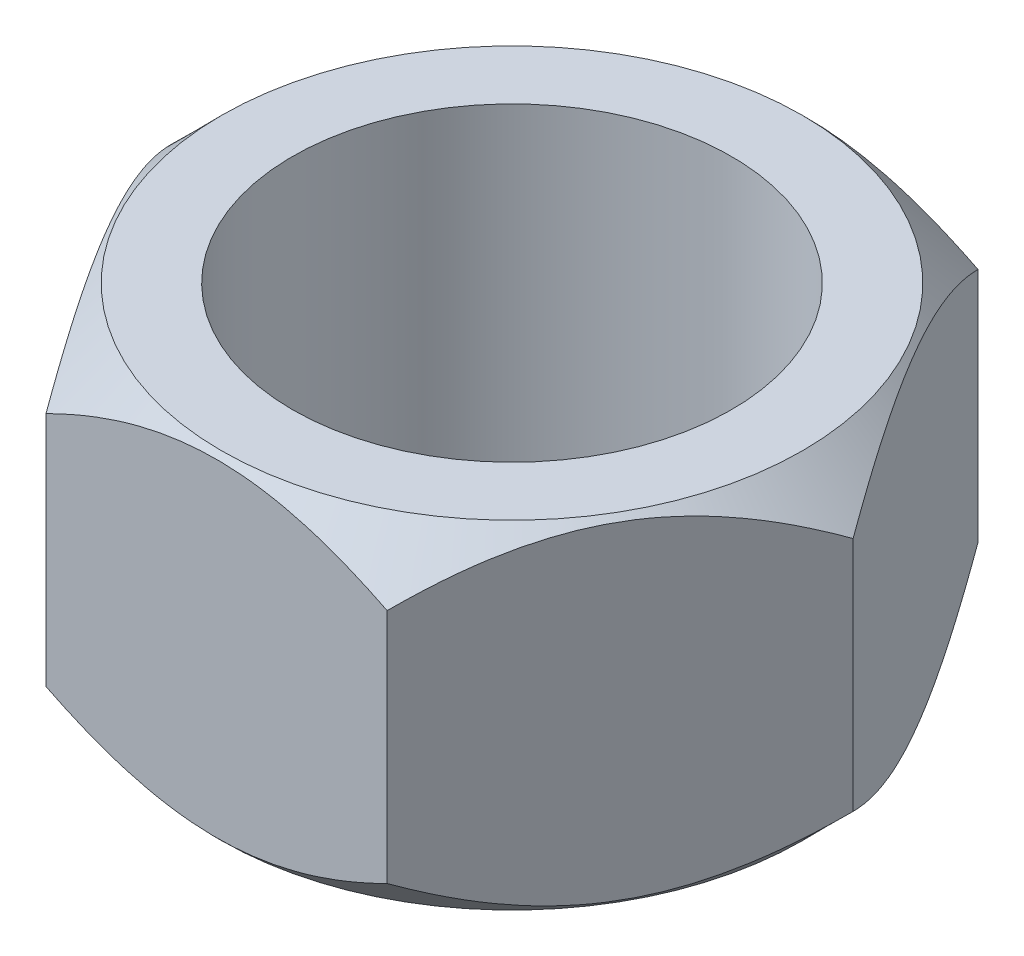
ISO-10303-21;
HEADER;
FILE_DESCRIPTION(('STEP AP214'),'2;1');
FILE_NAME('part.step','',(''),(''),'','','');
FILE_SCHEMA(('AUTOMOTIVE_DESIGN { 1 0 10303 214 1 1 1 1 }'));
ENDSEC;
DATA;
#1=APPLICATION_CONTEXT('core data for automotive mechanical design processes');
#2=APPLICATION_PROTOCOL_DEFINITION('international standard','automotive_design',2000,#1);
#3=PRODUCT_CONTEXT('',#1,'mechanical');
#4=PRODUCT('Part','Part','',(#3));
#5=PRODUCT_RELATED_PRODUCT_CATEGORY('part','',(#4));
#6=PRODUCT_DEFINITION_FORMATION('','',#4);
#7=PRODUCT_DEFINITION_CONTEXT('part definition',#1,'design');
#8=PRODUCT_DEFINITION('design','',#6,#7);
#9=PRODUCT_DEFINITION_SHAPE('','',#8);
#10=(LENGTH_UNIT() NAMED_UNIT(*) SI_UNIT(.MILLI.,.METRE.));
#11=(NAMED_UNIT(*) PLANE_ANGLE_UNIT() SI_UNIT($,.RADIAN.));
#12=(NAMED_UNIT(*) SI_UNIT($,.STERADIAN.) SOLID_ANGLE_UNIT());
#13=UNCERTAINTY_MEASURE_WITH_UNIT(LENGTH_MEASURE(1.E-05),#10,'distance_accuracy_value','');
#14=(GEOMETRIC_REPRESENTATION_CONTEXT(3) GLOBAL_UNCERTAINTY_ASSIGNED_CONTEXT((#13)) GLOBAL_UNIT_ASSIGNED_CONTEXT((#10,
#11,#12)) REPRESENTATION_CONTEXT('',''));
#15=CARTESIAN_POINT('',(0.,0.,0.));
#16=DIRECTION('',(0.,0.,1.));
#17=DIRECTION('',(1.,0.,0.));
#18=AXIS2_PLACEMENT_3D('',#15,#16,#17);
#19=CARTESIAN_POINT('',(0.,0.,0.));
#20=DIRECTION('',(0.,1.,0.));
#21=DIRECTION('',(0.,0.,1.));
#22=AXIS2_PLACEMENT_3D('',#19,#20,#21);
#23=PLANE('',#22);
#24=CARTESIAN_POINT('',(0.,0.,0.));
#25=DIRECTION('',(0.,1.,0.));
#26=DIRECTION('',(0.,0.,1.));
#27=AXIS2_PLACEMENT_3D('',#24,#25,#26);
#28=CIRCLE('',#27,0.13);
#29=CARTESIAN_POINT('',(0.,0.,0.13));
#30=VERTEX_POINT('',#29);
#31=EDGE_CURVE('E204',#30,#30,#28,.T.);
#32=ORIENTED_EDGE('',*,*,#31,.T.);
#33=EDGE_LOOP('',(#32));
#34=FACE_BOUND('',#33,.T.);
#35=CARTESIAN_POINT('',(0.,0.,0.));
#36=DIRECTION('',(0.,1.,0.));
#37=DIRECTION('',(-1.,0.,0.));
#38=AXIS2_PLACEMENT_3D('',#35,#36,#37);
#39=CIRCLE('',#38,0.172072594216369);
#40=CARTESIAN_POINT('',(-0.172072594216369,0.,0.));
#41=VERTEX_POINT('',#40);
#42=EDGE_CURVE('E220',#41,#41,#39,.T.);
#43=ORIENTED_EDGE('',*,*,#42,.F.);
#44=EDGE_LOOP('',(#43));
#45=FACE_BOUND('',#44,.T.);
#46=ADVANCED_FACE('F38',(#34,#45),#23,.F.);
#47=CARTESIAN_POINT('',(0.,0.2,0.));
#48=DIRECTION('',(0.,1.,0.));
#49=DIRECTION('',(0.,0.,1.));
#50=AXIS2_PLACEMENT_3D('',#47,#48,#49);
#51=PLANE('',#50);
#52=CARTESIAN_POINT('',(0.,0.2,0.));
#53=DIRECTION('',(0.,1.,0.));
#54=DIRECTION('',(-1.,0.,0.));
#55=AXIS2_PLACEMENT_3D('',#52,#53,#54);
#56=CIRCLE('',#55,0.172072594216369);
#57=CARTESIAN_POINT('',(-0.172072594216369,0.2,0.));
#58=VERTEX_POINT('',#57);
#59=EDGE_CURVE('E218',#58,#58,#56,.T.);
#60=ORIENTED_EDGE('',*,*,#59,.T.);
#61=EDGE_LOOP('',(#60));
#62=FACE_BOUND('',#61,.T.);
#63=CARTESIAN_POINT('',(0.,0.2,0.));
#64=DIRECTION('',(0.,1.,0.));
#65=DIRECTION('',(0.,0.,1.));
#66=AXIS2_PLACEMENT_3D('',#63,#64,#65);
#67=CIRCLE('',#66,0.13);
#68=CARTESIAN_POINT('',(0.,0.2,0.13));
#69=VERTEX_POINT('',#68);
#70=EDGE_CURVE('E205',#69,#69,#67,.T.);
#71=ORIENTED_EDGE('',*,*,#70,.F.);
#72=EDGE_LOOP('',(#71));
#73=FACE_BOUND('',#72,.T.);
#74=ADVANCED_FACE('F228',(#62,#73),#51,.T.);
#75=CARTESIAN_POINT('',(0.,0.2,0.));
#76=DIRECTION('',(0.,-1.,0.));
#77=DIRECTION('',(0.,0.,-1.));
#78=AXIS2_PLACEMENT_3D('',#75,#76,#77);
#79=CYLINDRICAL_SURFACE('',#78,0.13);
#80=ORIENTED_EDGE('',*,*,#70,.T.);
#81=EDGE_LOOP('',(#80));
#82=FACE_BOUND('',#81,.T.);
#83=ORIENTED_EDGE('',*,*,#31,.F.);
#84=EDGE_LOOP('',(#83));
#85=FACE_BOUND('',#84,.T.);
#86=ADVANCED_FACE('F142',(#82,#85),#79,.F.);
#87=CARTESIAN_POINT('',(0.,0.0299999999999999,0.));
#88=DIRECTION('',(0.,1.,0.));
#89=DIRECTION('',(-1.,0.,0.));
#90=AXIS2_PLACEMENT_3D('',#87,#88,#89);
#91=CONICAL_SURFACE('',#90,0.202072594216369,0.785398163397448);
#92=ORIENTED_EDGE('',*,*,#42,.T.);
#93=EDGE_LOOP('',(#92));
#94=FACE_BOUND('',#93,.T.);
#95=CARTESIAN_POINT('',(0.100920827054347,0.0301155689716211,-0.1752));
#96=CARTESIAN_POINT('',(0.104405260292326,0.0266353582002988,-0.169164784596238));
#97=CARTESIAN_POINT('',(0.107940762481044,0.0233561607693213,-0.163041115175108));
#98=CARTESIAN_POINT('',(0.115150475075317,0.0173509339832807,-0.150553526653857));
#99=CARTESIAN_POINT('',(0.11882537719765,0.0146282605899539,-0.144188409465133));
#100=CARTESIAN_POINT('',(0.129910950638422,0.00767257771140516,-0.124987633034681));
#101=CARTESIAN_POINT('',(0.137513721713938,0.0045071943387307,-0.111819247253572));
#102=CARTESIAN_POINT('',(0.150669909642199,0.00259198694259955,-0.0890320613278999));
#103=CARTESIAN_POINT('',(0.156187174943197,0.00283778648731033,-0.0794758775077346));
#104=CARTESIAN_POINT('',(0.167108928671852,0.00533803336826408,-0.0605588451419487));
#105=CARTESIAN_POINT('',(0.172513235467859,0.00759549393812473,-0.0511983111915746));
#106=CARTESIAN_POINT('',(0.182020226447782,0.0130527175286839,-0.0347317197872495));
#107=CARTESIAN_POINT('',(0.186166077345752,0.0159716193201154,-0.0275508953913604));
#108=CARTESIAN_POINT('',(0.194294770665068,0.0225492282802671,-0.0134715855631591));
#109=CARTESIAN_POINT('',(0.198278093053296,0.0262055337725978,-0.00657226880382148));
#110=CARTESIAN_POINT('',(0.202188064270427,0.0301155689700877,0.000200000000381542));
#111=B_SPLINE_CURVE_WITH_KNOTS('',3,(#95,#96,#97,#98,#99,#100,#101,#102,#103,#104,#105,#106,
#107,#108,#109,#110),.UNSPECIFIED.,.F.,.F.,(4,2,2,2,2,2,2,4),(0.,0.0233618368538911,
0.0468606447753589,0.0929709001337303,0.125885794260102,0.158850074087303,0.185183994279811,
0.211433492833064),.UNSPECIFIED.);
#112=CARTESIAN_POINT('',(0.101036297108185,0.03,-0.175));
#113=VERTEX_POINT('',#112);
#114=CARTESIAN_POINT('',(0.202072594216369,0.03,0.));
#115=VERTEX_POINT('',#114);
#116=EDGE_CURVE('E67',#113,#115,#111,.T.);
#117=ORIENTED_EDGE('',*,*,#116,.T.);
#118=CARTESIAN_POINT('',(0.202188064270207,0.0301155689716211,-0.000199999999999958));
#119=CARTESIAN_POINT('',(0.198703631032227,0.0266353582002988,0.00583521540376227));
#120=CARTESIAN_POINT('',(0.19516812884351,0.0233561607693213,0.0119588848248919));
#121=CARTESIAN_POINT('',(0.187958416249237,0.0173509339832807,0.0244464733461427));
#122=CARTESIAN_POINT('',(0.184283514126903,0.0146282605899538,0.0308115905348667));
#123=CARTESIAN_POINT('',(0.173197940686131,0.00767257771140512,0.0500123669653195));
#124=CARTESIAN_POINT('',(0.165595169610616,0.00450719433873066,0.0631807527464283));
#125=CARTESIAN_POINT('',(0.152438981682355,0.0025919869425995,0.0859679386721));
#126=CARTESIAN_POINT('',(0.146921716381357,0.00283778648731028,0.0955241224922653));
#127=CARTESIAN_POINT('',(0.135999962652701,0.00533803336826401,0.114441154858051));
#128=CARTESIAN_POINT('',(0.130595655856694,0.00759549393812464,0.123801688808425));
#129=CARTESIAN_POINT('',(0.121088664876772,0.0130527175286839,0.14026828021275));
#130=CARTESIAN_POINT('',(0.116942813978802,0.0159716193201153,0.14744910460864));
#131=CARTESIAN_POINT('',(0.108814120659485,0.022549228280267,0.161528414436841));
#132=CARTESIAN_POINT('',(0.104830798271257,0.0262055337725977,0.168427731196178));
#133=CARTESIAN_POINT('',(0.100920827054126,0.0301155689700876,0.175200000000381));
#134=B_SPLINE_CURVE_WITH_KNOTS('',3,(#118,#119,#120,#121,#122,#123,#124,#125,#126,#127,#128,
#129,#130,#131,#132,#133),.UNSPECIFIED.,.F.,.F.,(4,2,2,2,2,2,2,4),(0.,0.0233618368538911,
0.0468606447753589,0.0929709001337303,0.125885794260102,0.158850074087303,0.185183994279811,
0.211433492833064),.UNSPECIFIED.);
#135=CARTESIAN_POINT('',(0.101036297108184,0.03,0.175));
#136=VERTEX_POINT('',#135);
#137=EDGE_CURVE('E53',#115,#136,#134,.T.);
#138=ORIENTED_EDGE('',*,*,#137,.T.);
#139=CARTESIAN_POINT('',(0.305523676388779,0.180020741185077,0.175));
#140=CARTESIAN_POINT('',(0.296489908838128,0.172183831382913,0.175));
#141=CARTESIAN_POINT('',(0.287415146295134,0.164392967909618,0.175));
#142=CARTESIAN_POINT('',(0.269154387743842,0.148934007099863,0.175));
#143=CARTESIAN_POINT('',(0.259968341025768,0.141265969735403,0.175));
#144=CARTESIAN_POINT('',(0.231792912014466,0.118159352301111,0.175));
#145=CARTESIAN_POINT('',(0.212593498149154,0.102976933592517,0.175));
#146=CARTESIAN_POINT('',(0.173225826261024,0.0737968112831862,0.175));
#147=CARTESIAN_POINT('',(0.153056247455228,0.0598007987664811,0.175));
#148=CARTESIAN_POINT('',(0.121625871967723,0.0408846564593254,0.175));
#149=CARTESIAN_POINT('',(0.11099252232747,0.0349428850748384,0.175));
#150=CARTESIAN_POINT('',(0.0892065324424293,0.0241236116347811,0.175));
#151=CARTESIAN_POINT('',(0.0780548914239592,0.0192441570129829,0.175));
#152=CARTESIAN_POINT('',(0.0548893532905646,0.0110090414325916,0.175));
#153=CARTESIAN_POINT('',(0.0428618105988857,0.00768961095311468,0.175));
#154=CARTESIAN_POINT('',(0.0184374809922964,0.00349261265701018,0.175));
#155=CARTESIAN_POINT('',(0.00604375843554659,0.0025986056139428,0.175));
#156=CARTESIAN_POINT('',(-0.0186589035579445,0.00348347437230432,0.175));
#157=CARTESIAN_POINT('',(-0.0309676778388246,0.0052665811470203,0.175));
#158=CARTESIAN_POINT('',(-0.0551218355376362,0.0110204288976895,0.175));
#159=CARTESIAN_POINT('',(-0.0669628912364721,0.0150080075104535,0.175));
#160=CARTESIAN_POINT('',(-0.0925903967170618,0.025491312778155,0.175));
#161=CARTESIAN_POINT('',(-0.10622239796311,0.0323479327338906,0.175));
#162=CARTESIAN_POINT('',(-0.13278508300803,0.0473282769905635,0.175));
#163=CARTESIAN_POINT('',(-0.145713884757196,0.0554551958902634,0.175));
#164=CARTESIAN_POINT('',(-0.171116757407901,0.0725030550642842,0.175));
#165=CARTESIAN_POINT('',(-0.183588422373837,0.081427526652935,0.175));
#166=CARTESIAN_POINT('',(-0.208171534529213,0.0997613344596471,0.175));
#167=CARTESIAN_POINT('',(-0.220282872493366,0.109170815382806,0.175));
#168=CARTESIAN_POINT('',(-0.244773267048622,0.128729600372015,0.175));
#169=CARTESIAN_POINT('',(-0.257140782569692,0.138893253718197,0.175));
#170=CARTESIAN_POINT('',(-0.281533947754554,0.15935584068324,0.175));
#171=CARTESIAN_POINT('',(-0.293561858362561,0.169652072271717,0.175));
#172=CARTESIAN_POINT('',(-0.305523676388794,0.180020741185058,0.175));
#173=B_SPLINE_CURVE_WITH_KNOTS('',3,(#139,#140,#141,#142,#143,#144,#145,#146,#147,#148,#149,
#150,#151,#152,#153,#154,#155,#156,#157,#158,#159,#160,#161,#162,#163,#164,#165,#166,#167,#168,
#169,#170,#171,#172),.UNSPECIFIED.,.F.,.F.,(4,2,2,2,2,2,2,2,2,2,2,2,2,2,2,2,4),(0.,
0.0358791858717531,0.0717753868661951,0.145194810618015,0.218717184603454,0.255222439137126,
0.291660018720837,0.328906459590412,0.365899810358558,0.402951687859046,0.440290555644728,
0.485949579311968,0.531725332469435,0.577714888588237,0.623718246264904,0.671738421373986,
0.719232498658548),.UNSPECIFIED.);
#174=CARTESIAN_POINT('',(-0.101036297108185,0.0299999999999999,0.175));
#175=VERTEX_POINT('',#174);
#176=EDGE_CURVE('E101',#136,#175,#173,.T.);
#177=ORIENTED_EDGE('',*,*,#176,.T.);
#178=CARTESIAN_POINT('',(-0.100920827054347,0.030115568971621,0.1752));
#179=CARTESIAN_POINT('',(-0.104405260292326,0.0266353582002987,0.169164784596238));
#180=CARTESIAN_POINT('',(-0.107940762481044,0.0233561607693212,0.163041115175108));
#181=CARTESIAN_POINT('',(-0.115150475075317,0.0173509339832806,0.150553526653857));
#182=CARTESIAN_POINT('',(-0.11882537719765,0.0146282605899538,0.144188409465133));
#183=CARTESIAN_POINT('',(-0.129910950638422,0.00767257771140507,0.12498763303468));
#184=CARTESIAN_POINT('',(-0.137513721713938,0.00450719433873059,0.111819247253572));
#185=CARTESIAN_POINT('',(-0.150669909642199,0.00259198694259942,0.0890320613278999));
#186=CARTESIAN_POINT('',(-0.156187174943197,0.00283778648731021,0.0794758775077346));
#187=CARTESIAN_POINT('',(-0.167108928671852,0.00533803336826396,0.0605588451419486));
#188=CARTESIAN_POINT('',(-0.172513235467859,0.0075954939381246,0.0511983111915746));
#189=CARTESIAN_POINT('',(-0.182020226447782,0.0130527175286838,0.0347317197872494));
#190=CARTESIAN_POINT('',(-0.186166077345752,0.0159716193201152,0.0275508953913604));
#191=CARTESIAN_POINT('',(-0.194294770665068,0.022549228280267,0.0134715855631591));
#192=CARTESIAN_POINT('',(-0.198278093053296,0.0262055337725976,0.00657226880382153));
#193=CARTESIAN_POINT('',(-0.202188064270427,0.0301155689700875,-0.000200000000381459));
#194=B_SPLINE_CURVE_WITH_KNOTS('',3,(#178,#179,#180,#181,#182,#183,#184,#185,#186,#187,#188,
#189,#190,#191,#192,#193),.UNSPECIFIED.,.F.,.F.,(4,2,2,2,2,2,2,4),(0.,0.0233618368538911,
0.0468606447753589,0.0929709001337303,0.125885794260102,0.158850074087303,0.185183994279811,
0.211433492833064),.UNSPECIFIED.);
#195=CARTESIAN_POINT('',(-0.202072594216369,0.0299999999999998,0.));
#196=VERTEX_POINT('',#195);
#197=EDGE_CURVE('E95',#175,#196,#194,.T.);
#198=ORIENTED_EDGE('',*,*,#197,.T.);
#199=CARTESIAN_POINT('',(-0.202188064270207,0.0301155689716209,0.000200000000000051));
#200=CARTESIAN_POINT('',(-0.198703631032227,0.0266353582002986,-0.00583521540376216));
#201=CARTESIAN_POINT('',(-0.19516812884351,0.0233561607693211,-0.0119588848248918));
#202=CARTESIAN_POINT('',(-0.187958416249237,0.0173509339832805,-0.0244464733461426));
#203=CARTESIAN_POINT('',(-0.184283514126903,0.0146282605899537,-0.0308115905348666));
#204=CARTESIAN_POINT('',(-0.173197940686132,0.00767257771140499,-0.0500123669653194));
#205=CARTESIAN_POINT('',(-0.165595169610616,0.00450719433873053,-0.0631807527464281));
#206=CARTESIAN_POINT('',(-0.152438981682355,0.00259198694259934,-0.0859679386720999));
#207=CARTESIAN_POINT('',(-0.146921716381357,0.00283778648731011,-0.0955241224922651));
#208=CARTESIAN_POINT('',(-0.135999962652702,0.00533803336826384,-0.114441154858051));
#209=CARTESIAN_POINT('',(-0.130595655856694,0.00759549393812448,-0.123801688808425));
#210=CARTESIAN_POINT('',(-0.121088664876772,0.0130527175286837,-0.14026828021275));
#211=CARTESIAN_POINT('',(-0.116942813978802,0.0159716193201151,-0.147449104608639));
#212=CARTESIAN_POINT('',(-0.108814120659486,0.0225492282802669,-0.161528414436841));
#213=CARTESIAN_POINT('',(-0.104830798271257,0.0262055337725976,-0.168427731196178));
#214=CARTESIAN_POINT('',(-0.100920827054126,0.0301155689700875,-0.175200000000381));
#215=B_SPLINE_CURVE_WITH_KNOTS('',3,(#199,#200,#201,#202,#203,#204,#205,#206,#207,#208,#209,
#210,#211,#212,#213,#214),.UNSPECIFIED.,.F.,.F.,(4,2,2,2,2,2,2,4),(0.,0.0233618368538911,
0.0468606447753588,0.0929709001337301,0.125885794260101,0.158850074087303,0.185183994279811,
0.211433492833064),.UNSPECIFIED.);
#216=CARTESIAN_POINT('',(-0.101036297108184,0.0299999999999999,-0.175));
#217=VERTEX_POINT('',#216);
#218=EDGE_CURVE('E98',#196,#217,#215,.T.);
#219=ORIENTED_EDGE('',*,*,#218,.T.);
#220=CARTESIAN_POINT('',(-0.305523676388779,0.180020741185077,-0.175));
#221=CARTESIAN_POINT('',(-0.296489908838128,0.172183831382913,-0.175));
#222=CARTESIAN_POINT('',(-0.287415146295134,0.164392967909618,-0.175));
#223=CARTESIAN_POINT('',(-0.269154387743842,0.148934007099863,-0.175));
#224=CARTESIAN_POINT('',(-0.259968341025768,0.141265969735403,-0.175));
#225=CARTESIAN_POINT('',(-0.231792912014466,0.118159352301111,-0.175));
#226=CARTESIAN_POINT('',(-0.212593498149154,0.102976933592516,-0.175));
#227=CARTESIAN_POINT('',(-0.173225826261024,0.073796811283186,-0.175));
#228=CARTESIAN_POINT('',(-0.153056247455228,0.059800798766481,-0.175));
#229=CARTESIAN_POINT('',(-0.121625871967723,0.0408846564593253,-0.175));
#230=CARTESIAN_POINT('',(-0.11099252232747,0.0349428850748383,-0.175));
#231=CARTESIAN_POINT('',(-0.0892065324424293,0.024123611634781,-0.175));
#232=CARTESIAN_POINT('',(-0.0780548914239592,0.0192441570129828,-0.175));
#233=CARTESIAN_POINT('',(-0.0548893532905645,0.0110090414325915,-0.175));
#234=CARTESIAN_POINT('',(-0.0428618105988856,0.00768961095311462,-0.175));
#235=CARTESIAN_POINT('',(-0.0184374809922963,0.00349261265701016,-0.175));
#236=CARTESIAN_POINT('',(-0.00604375843554655,0.00259860561394281,-0.175));
#237=CARTESIAN_POINT('',(0.0186589035579445,0.00348347437230435,-0.175));
#238=CARTESIAN_POINT('',(0.0309676778388246,0.00526658114702033,-0.175));
#239=CARTESIAN_POINT('',(0.0551218355376362,0.0110204288976896,-0.175));
#240=CARTESIAN_POINT('',(0.0669628912364721,0.0150080075104535,-0.175));
#241=CARTESIAN_POINT('',(0.0925903967170617,0.0254913127781551,-0.175));
#242=CARTESIAN_POINT('',(0.10622239796311,0.0323479327338907,-0.175));
#243=CARTESIAN_POINT('',(0.13278508300803,0.0473282769905635,-0.175));
#244=CARTESIAN_POINT('',(0.145713884757196,0.0554551958902634,-0.175));
#245=CARTESIAN_POINT('',(0.171116757407901,0.0725030550642843,-0.175));
#246=CARTESIAN_POINT('',(0.183588422373837,0.0814275266529352,-0.175));
#247=CARTESIAN_POINT('',(0.208171534529213,0.0997613344596472,-0.175));
#248=CARTESIAN_POINT('',(0.220282872493365,0.109170815382806,-0.175));
#249=CARTESIAN_POINT('',(0.244773267048622,0.128729600372015,-0.175));
#250=CARTESIAN_POINT('',(0.257140782569692,0.138893253718197,-0.175));
#251=CARTESIAN_POINT('',(0.281533947754554,0.15935584068324,-0.175));
#252=CARTESIAN_POINT('',(0.293561858362561,0.169652072271717,-0.175));
#253=CARTESIAN_POINT('',(0.305523676388794,0.180020741185059,-0.175));
#254=B_SPLINE_CURVE_WITH_KNOTS('',3,(#220,#221,#222,#223,#224,#225,#226,#227,#228,#229,#230,
#231,#232,#233,#234,#235,#236,#237,#238,#239,#240,#241,#242,#243,#244,#245,#246,#247,#248,#249,
#250,#251,#252,#253),.UNSPECIFIED.,.F.,.F.,(4,2,2,2,2,2,2,2,2,2,2,2,2,2,2,2,4),(0.,
0.035879185871753,0.0717753868661949,0.145194810618015,0.218717184603454,0.255222439137126,
0.291660018720837,0.328906459590412,0.365899810358558,0.402951687859046,0.440290555644728,
0.485949579311968,0.531725332469435,0.577714888588236,0.623718246264904,0.671738421373985,
0.719232498658548),.UNSPECIFIED.);
#255=EDGE_CURVE('E115',#217,#113,#254,.T.);
#256=ORIENTED_EDGE('',*,*,#255,.T.);
#257=EDGE_LOOP('',(#117,#138,#177,#198,#219,#256));
#258=FACE_BOUND('',#257,.T.);
#259=ADVANCED_FACE('F97',(#94,#258),#91,.T.);
#260=CARTESIAN_POINT('',(0.,0.2,0.));
#261=DIRECTION('',(0.,-1.,0.));
#262=DIRECTION('',(1.,0.,0.));
#263=AXIS2_PLACEMENT_3D('',#260,#261,#262);
#264=CONICAL_SURFACE('',#263,0.172072594216369,0.785398163397448);
#265=ORIENTED_EDGE('',*,*,#59,.F.);
#266=EDGE_LOOP('',(#265));
#267=FACE_BOUND('',#266,.T.);
#268=CARTESIAN_POINT('',(0.202188064270207,0.169884431028379,0.000200000000000035));
#269=CARTESIAN_POINT('',(0.198703631032227,0.173364641799701,-0.00583521540376217));
#270=CARTESIAN_POINT('',(0.19516812884351,0.176643839230679,-0.0119588848248918));
#271=CARTESIAN_POINT('',(0.187958416249237,0.182649066016719,-0.0244464733461426));
#272=CARTESIAN_POINT('',(0.184283514126903,0.185371739410046,-0.0308115905348666));
#273=CARTESIAN_POINT('',(0.173197940686132,0.192327422288595,-0.0500123669653194));
#274=CARTESIAN_POINT('',(0.165595169610616,0.195492805661269,-0.0631807527464281));
#275=CARTESIAN_POINT('',(0.152438981682355,0.1974080130574,-0.0859679386720999));
#276=CARTESIAN_POINT('',(0.146921716381357,0.19716221351269,-0.0955241224922652));
#277=CARTESIAN_POINT('',(0.135999962652702,0.194661966631736,-0.114441154858051));
#278=CARTESIAN_POINT('',(0.130595655856695,0.192404506061875,-0.123801688808425));
#279=CARTESIAN_POINT('',(0.121088664876772,0.186947282471316,-0.14026828021275));
#280=CARTESIAN_POINT('',(0.116942813978802,0.184028380679885,-0.147449104608639));
#281=CARTESIAN_POINT('',(0.108814120659486,0.177450771719733,-0.161528414436841));
#282=CARTESIAN_POINT('',(0.104830798271258,0.173794466227402,-0.168427731196178));
#283=CARTESIAN_POINT('',(0.100920827054126,0.169884431029912,-0.175200000000381));
#284=B_SPLINE_CURVE_WITH_KNOTS('',3,(#268,#269,#270,#271,#272,#273,#274,#275,#276,#277,#278,
#279,#280,#281,#282,#283),.UNSPECIFIED.,.F.,.F.,(4,2,2,2,2,2,2,4),(0.,0.023361836853891,
0.0468606447753588,0.0929709001337301,0.125885794260101,0.158850074087303,0.185183994279811,
0.211433492833064),.UNSPECIFIED.);
#285=CARTESIAN_POINT('',(0.202072594216369,0.17,0.));
#286=VERTEX_POINT('',#285);
#287=CARTESIAN_POINT('',(0.101036297108185,0.17,-0.175));
#288=VERTEX_POINT('',#287);
#289=EDGE_CURVE('E192',#286,#288,#284,.T.);
#290=ORIENTED_EDGE('',*,*,#289,.T.);
#291=CARTESIAN_POINT('',(0.305523676388779,0.019979258814923,-0.175));
#292=CARTESIAN_POINT('',(0.296489908838128,0.0278161686170869,-0.175));
#293=CARTESIAN_POINT('',(0.287415146295134,0.0356070320903823,-0.175));
#294=CARTESIAN_POINT('',(0.269154387743842,0.0510659929001369,-0.175));
#295=CARTESIAN_POINT('',(0.259968341025768,0.0587340302645972,-0.175));
#296=CARTESIAN_POINT('',(0.231792912014466,0.0818406476988891,-0.175));
#297=CARTESIAN_POINT('',(0.212593498149154,0.0970230664074833,-0.175));
#298=CARTESIAN_POINT('',(0.173225826261024,0.126203188716814,-0.175));
#299=CARTESIAN_POINT('',(0.153056247455228,0.140199201233519,-0.175));
#300=CARTESIAN_POINT('',(0.121625871967723,0.159115343540675,-0.175));
#301=CARTESIAN_POINT('',(0.11099252232747,0.165057114925162,-0.175));
#302=CARTESIAN_POINT('',(0.0892065324424293,0.175876388365219,-0.175));
#303=CARTESIAN_POINT('',(0.0780548914239592,0.180755842987017,-0.175));
#304=CARTESIAN_POINT('',(0.0548893532905646,0.188990958567408,-0.175));
#305=CARTESIAN_POINT('',(0.0428618105988856,0.192310389046885,-0.175));
#306=CARTESIAN_POINT('',(0.0184374809922964,0.19650738734299,-0.175));
#307=CARTESIAN_POINT('',(0.00604375843554655,0.197401394386057,-0.175));
#308=CARTESIAN_POINT('',(-0.0186589035579446,0.196516525627696,-0.175));
#309=CARTESIAN_POINT('',(-0.0309676778388247,0.19473341885298,-0.175));
#310=CARTESIAN_POINT('',(-0.0551218355376363,0.18897957110231,-0.175));
#311=CARTESIAN_POINT('',(-0.0669628912364722,0.184991992489546,-0.175));
#312=CARTESIAN_POINT('',(-0.0925903967170618,0.174508687221845,-0.175));
#313=CARTESIAN_POINT('',(-0.10622239796311,0.167652067266109,-0.175));
#314=CARTESIAN_POINT('',(-0.13278508300803,0.152671723009436,-0.175));
#315=CARTESIAN_POINT('',(-0.145713884757196,0.144544804109736,-0.175));
#316=CARTESIAN_POINT('',(-0.171116757407901,0.127496944935716,-0.175));
#317=CARTESIAN_POINT('',(-0.183588422373837,0.118572473347065,-0.175));
#318=CARTESIAN_POINT('',(-0.208171534529213,0.100238665540353,-0.175));
#319=CARTESIAN_POINT('',(-0.220282872493366,0.0908291846171942,-0.175));
#320=CARTESIAN_POINT('',(-0.244773267048622,0.0712703996279849,-0.175));
#321=CARTESIAN_POINT('',(-0.257140782569692,0.0611067462818029,-0.175));
#322=CARTESIAN_POINT('',(-0.281533947754554,0.0406441593167598,-0.175));
#323=CARTESIAN_POINT('',(-0.293561858362561,0.0303479277282827,-0.175));
#324=CARTESIAN_POINT('',(-0.305523676388794,0.0199792588149415,-0.175));
#325=B_SPLINE_CURVE_WITH_KNOTS('',3,(#291,#292,#293,#294,#295,#296,#297,#298,#299,#300,#301,
#302,#303,#304,#305,#306,#307,#308,#309,#310,#311,#312,#313,#314,#315,#316,#317,#318,#319,#320,
#321,#322,#323,#324),.UNSPECIFIED.,.F.,.F.,(4,2,2,2,2,2,2,2,2,2,2,2,2,2,2,2,4),(0.,
0.0358791858717531,0.0717753868661951,0.145194810618015,0.218717184603454,0.255222439137126,
0.291660018720837,0.328906459590412,0.365899810358558,0.402951687859047,0.440290555644728,
0.485949579311968,0.531725332469435,0.577714888588237,0.623718246264904,0.671738421373986,
0.719232498658548),.UNSPECIFIED.);
#326=CARTESIAN_POINT('',(-0.101036297108184,0.17,-0.175));
#327=VERTEX_POINT('',#326);
#328=EDGE_CURVE('E185',#288,#327,#325,.T.);
#329=ORIENTED_EDGE('',*,*,#328,.T.);
#330=CARTESIAN_POINT('',(-0.100920827054347,0.169884431028379,-0.1752));
#331=CARTESIAN_POINT('',(-0.104405260292326,0.173364641799701,-0.169164784596238));
#332=CARTESIAN_POINT('',(-0.107940762481044,0.176643839230679,-0.163041115175108));
#333=CARTESIAN_POINT('',(-0.115150475075317,0.182649066016719,-0.150553526653857));
#334=CARTESIAN_POINT('',(-0.11882537719765,0.185371739410046,-0.144188409465133));
#335=CARTESIAN_POINT('',(-0.129910950638422,0.192327422288595,-0.12498763303468));
#336=CARTESIAN_POINT('',(-0.137513721713938,0.195492805661269,-0.111819247253572));
#337=CARTESIAN_POINT('',(-0.150669909642199,0.197408013057401,-0.0890320613279));
#338=CARTESIAN_POINT('',(-0.156187174943197,0.19716221351269,-0.0794758775077347));
#339=CARTESIAN_POINT('',(-0.167108928671852,0.194661966631736,-0.0605588451419487));
#340=CARTESIAN_POINT('',(-0.172513235467859,0.192404506061875,-0.0511983111915747));
#341=CARTESIAN_POINT('',(-0.182020226447782,0.186947282471316,-0.0347317197872495));
#342=CARTESIAN_POINT('',(-0.186166077345752,0.184028380679885,-0.0275508953913604));
#343=CARTESIAN_POINT('',(-0.194294770665068,0.177450771719733,-0.0134715855631591));
#344=CARTESIAN_POINT('',(-0.198278093053296,0.173794466227402,-0.00657226880382148));
#345=CARTESIAN_POINT('',(-0.202188064270427,0.169884431029912,0.000200000000381566));
#346=B_SPLINE_CURVE_WITH_KNOTS('',3,(#330,#331,#332,#333,#334,#335,#336,#337,#338,#339,#340,
#341,#342,#343,#344,#345),.UNSPECIFIED.,.F.,.F.,(4,2,2,2,2,2,2,4),(0.,0.0233618368538911,
0.0468606447753589,0.0929709001337304,0.125885794260102,0.158850074087303,0.185183994279811,
0.211433492833065),.UNSPECIFIED.);
#347=CARTESIAN_POINT('',(-0.202072594216369,0.17,0.));
#348=VERTEX_POINT('',#347);
#349=EDGE_CURVE('E193',#327,#348,#346,.T.);
#350=ORIENTED_EDGE('',*,*,#349,.T.);
#351=CARTESIAN_POINT('',(-0.202188064270207,0.169884431028379,-0.000199999999999949));
#352=CARTESIAN_POINT('',(-0.198703631032227,0.173364641799701,0.00583521540376226));
#353=CARTESIAN_POINT('',(-0.19516812884351,0.176643839230679,0.0119588848248919));
#354=CARTESIAN_POINT('',(-0.187958416249237,0.182649066016719,0.0244464733461427));
#355=CARTESIAN_POINT('',(-0.184283514126903,0.185371739410046,0.0308115905348666));
#356=CARTESIAN_POINT('',(-0.173197940686132,0.192327422288595,0.0500123669653194));
#357=CARTESIAN_POINT('',(-0.165595169610616,0.195492805661269,0.0631807527464281));
#358=CARTESIAN_POINT('',(-0.152438981682355,0.1974080130574,0.0859679386720998));
#359=CARTESIAN_POINT('',(-0.146921716381357,0.19716221351269,0.0955241224922651));
#360=CARTESIAN_POINT('',(-0.135999962652702,0.194661966631736,0.114441154858051));
#361=CARTESIAN_POINT('',(-0.130595655856695,0.192404506061875,0.123801688808425));
#362=CARTESIAN_POINT('',(-0.121088664876772,0.186947282471316,0.14026828021275));
#363=CARTESIAN_POINT('',(-0.116942813978802,0.184028380679885,0.147449104608639));
#364=CARTESIAN_POINT('',(-0.108814120659486,0.177450771719733,0.161528414436841));
#365=CARTESIAN_POINT('',(-0.104830798271258,0.173794466227402,0.168427731196178));
#366=CARTESIAN_POINT('',(-0.100920827054126,0.169884431029912,0.175200000000382));
#367=B_SPLINE_CURVE_WITH_KNOTS('',3,(#351,#352,#353,#354,#355,#356,#357,#358,#359,#360,#361,
#362,#363,#364,#365,#366),.UNSPECIFIED.,.F.,.F.,(4,2,2,2,2,2,2,4),(0.,0.023361836853891,
0.0468606447753587,0.09297090013373,0.125885794260101,0.158850074087302,0.185183994279811,
0.211433492833064),.UNSPECIFIED.);
#368=CARTESIAN_POINT('',(-0.101036297108185,0.17,0.175));
#369=VERTEX_POINT('',#368);
#370=EDGE_CURVE('E119',#348,#369,#367,.T.);
#371=ORIENTED_EDGE('',*,*,#370,.T.);
#372=CARTESIAN_POINT('',(-0.305523676388779,0.0199792588149227,0.175));
#373=CARTESIAN_POINT('',(-0.296489908838128,0.0278161686170867,0.175));
#374=CARTESIAN_POINT('',(-0.287415146295134,0.035607032090382,0.175));
#375=CARTESIAN_POINT('',(-0.269154387743842,0.0510659929001366,0.175));
#376=CARTESIAN_POINT('',(-0.259968341025768,0.058734030264597,0.175));
#377=CARTESIAN_POINT('',(-0.231792912014466,0.0818406476988889,0.175));
#378=CARTESIAN_POINT('',(-0.212593498149154,0.0970230664074832,0.175));
#379=CARTESIAN_POINT('',(-0.173225826261025,0.126203188716814,0.175));
#380=CARTESIAN_POINT('',(-0.153056247455228,0.140199201233519,0.175));
#381=CARTESIAN_POINT('',(-0.121625871967723,0.159115343540674,0.175));
#382=CARTESIAN_POINT('',(-0.11099252232747,0.165057114925161,0.175));
#383=CARTESIAN_POINT('',(-0.0892065324424294,0.175876388365219,0.175));
#384=CARTESIAN_POINT('',(-0.0780548914239593,0.180755842987017,0.175));
#385=CARTESIAN_POINT('',(-0.0548893532905647,0.188990958567408,0.175));
#386=CARTESIAN_POINT('',(-0.0428618105988858,0.192310389046885,0.175));
#387=CARTESIAN_POINT('',(-0.0184374809922965,0.19650738734299,0.175));
#388=CARTESIAN_POINT('',(-0.00604375843554666,0.197401394386057,0.175));
#389=CARTESIAN_POINT('',(0.0186589035579444,0.196516525627696,0.175));
#390=CARTESIAN_POINT('',(0.0309676778388245,0.19473341885298,0.175));
#391=CARTESIAN_POINT('',(0.0551218355376361,0.18897957110231,0.175));
#392=CARTESIAN_POINT('',(0.0669628912364721,0.184991992489546,0.175));
#393=CARTESIAN_POINT('',(0.0925903967170617,0.174508687221845,0.175));
#394=CARTESIAN_POINT('',(0.10622239796311,0.167652067266109,0.175));
#395=CARTESIAN_POINT('',(0.13278508300803,0.152671723009437,0.175));
#396=CARTESIAN_POINT('',(0.145713884757196,0.144544804109737,0.175));
#397=CARTESIAN_POINT('',(0.171116757407901,0.127496944935716,0.175));
#398=CARTESIAN_POINT('',(0.183588422373837,0.118572473347065,0.175));
#399=CARTESIAN_POINT('',(0.208171534529213,0.100238665540353,0.175));
#400=CARTESIAN_POINT('',(0.220282872493366,0.0908291846171944,0.175));
#401=CARTESIAN_POINT('',(0.244773267048622,0.0712703996279851,0.175));
#402=CARTESIAN_POINT('',(0.257140782569692,0.0611067462818032,0.175));
#403=CARTESIAN_POINT('',(0.281533947754554,0.0406441593167601,0.175));
#404=CARTESIAN_POINT('',(0.293561858362561,0.030347927728283,0.175));
#405=CARTESIAN_POINT('',(0.305523676388794,0.0199792588149418,0.175));
#406=B_SPLINE_CURVE_WITH_KNOTS('',3,(#372,#373,#374,#375,#376,#377,#378,#379,#380,#381,#382,
#383,#384,#385,#386,#387,#388,#389,#390,#391,#392,#393,#394,#395,#396,#397,#398,#399,#400,#401,
#402,#403,#404,#405),.UNSPECIFIED.,.F.,.F.,(4,2,2,2,2,2,2,2,2,2,2,2,2,2,2,2,4),(0.,
0.0358791858717531,0.071775386866195,0.145194810618015,0.218717184603454,0.255222439137126,
0.291660018720837,0.328906459590412,0.365899810358558,0.402951687859047,0.440290555644728,
0.485949579311968,0.531725332469435,0.577714888588237,0.623718246264904,0.671738421373986,
0.719232498658548),.UNSPECIFIED.);
#407=CARTESIAN_POINT('',(0.101036297108184,0.17,0.175));
#408=VERTEX_POINT('',#407);
#409=EDGE_CURVE('E59',#369,#408,#406,.T.);
#410=ORIENTED_EDGE('',*,*,#409,.T.);
#411=CARTESIAN_POINT('',(0.100920827054347,0.169884431028379,0.1752));
#412=CARTESIAN_POINT('',(0.104405260292326,0.173364641799701,0.169164784596238));
#413=CARTESIAN_POINT('',(0.107940762481044,0.176643839230679,0.163041115175108));
#414=CARTESIAN_POINT('',(0.115150475075317,0.182649066016719,0.150553526653857));
#415=CARTESIAN_POINT('',(0.11882537719765,0.185371739410046,0.144188409465133));
#416=CARTESIAN_POINT('',(0.129910950638422,0.192327422288595,0.124987633034681));
#417=CARTESIAN_POINT('',(0.137513721713938,0.195492805661269,0.111819247253572));
#418=CARTESIAN_POINT('',(0.150669909642199,0.1974080130574,0.0890320613279001));
#419=CARTESIAN_POINT('',(0.156187174943197,0.19716221351269,0.0794758775077349));
#420=CARTESIAN_POINT('',(0.167108928671852,0.194661966631736,0.0605588451419489));
#421=CARTESIAN_POINT('',(0.172513235467859,0.192404506061875,0.0511983111915748));
#422=CARTESIAN_POINT('',(0.182020226447782,0.186947282471316,0.0347317197872497));
#423=CARTESIAN_POINT('',(0.186166077345752,0.184028380679885,0.0275508953913605));
#424=CARTESIAN_POINT('',(0.194294770665068,0.177450771719733,0.0134715855631592));
#425=CARTESIAN_POINT('',(0.198278093053296,0.173794466227402,0.00657226880382155));
#426=CARTESIAN_POINT('',(0.202188064270427,0.169884431029912,-0.000200000000381496));
#427=B_SPLINE_CURVE_WITH_KNOTS('',3,(#411,#412,#413,#414,#415,#416,#417,#418,#419,#420,#421,
#422,#423,#424,#425,#426),.UNSPECIFIED.,.F.,.F.,(4,2,2,2,2,2,2,4),(0.,0.023361836853891,
0.0468606447753588,0.0929709001337301,0.125885794260101,0.158850074087303,0.185183994279811,
0.211433492833064),.UNSPECIFIED.);
#428=EDGE_CURVE('E12',#408,#286,#427,.T.);
#429=ORIENTED_EDGE('',*,*,#428,.T.);
#430=EDGE_LOOP('',(#290,#329,#350,#371,#410,#429));
#431=FACE_BOUND('',#430,.T.);
#432=ADVANCED_FACE('F141',(#267,#431),#264,.T.);
#433=CARTESIAN_POINT('',(0.101036297108184,0.2,0.175));
#434=DIRECTION('',(-0.866025403784438,0.,-0.5));
#435=DIRECTION('',(-0.5,0.,0.866025403784439));
#436=AXIS2_PLACEMENT_3D('',#433,#434,#435);
#437=PLANE('',#436);
#438=ORIENTED_EDGE('',*,*,#428,.F.);
#439=DIRECTION('',(0.,-1.,0.));
#440=VECTOR('',#439,1.);
#441=CARTESIAN_POINT('',(0.101036297108184,0.2,0.175));
#442=LINE('',#441,#440);
#443=EDGE_CURVE('E124',#408,#136,#442,.T.);
#444=ORIENTED_EDGE('',*,*,#443,.T.);
#445=ORIENTED_EDGE('',*,*,#137,.F.);
#446=DIRECTION('',(0.,-1.,0.));
#447=VECTOR('',#446,1.);
#448=CARTESIAN_POINT('',(0.202072594216369,0.2,0.));
#449=LINE('',#448,#447);
#450=EDGE_CURVE('E208',#286,#115,#449,.T.);
#451=ORIENTED_EDGE('',*,*,#450,.F.);
#452=EDGE_LOOP('',(#438,#444,#445,#451));
#453=FACE_BOUND('',#452,.T.);
#454=ADVANCED_FACE('F134',(#453),#437,.F.);
#455=CARTESIAN_POINT('',(-0.101036297108185,0.2,0.175));
#456=DIRECTION('',(0.,0.,-1.));
#457=DIRECTION('',(-1.,0.,0.));
#458=AXIS2_PLACEMENT_3D('',#455,#456,#457);
#459=PLANE('',#458);
#460=ORIENTED_EDGE('',*,*,#409,.F.);
#461=DIRECTION('',(0.,-1.,0.));
#462=VECTOR('',#461,1.);
#463=CARTESIAN_POINT('',(-0.101036297108185,0.2,0.175));
#464=LINE('',#463,#462);
#465=EDGE_CURVE('E120',#369,#175,#464,.T.);
#466=ORIENTED_EDGE('',*,*,#465,.T.);
#467=ORIENTED_EDGE('',*,*,#176,.F.);
#468=ORIENTED_EDGE('',*,*,#443,.F.);
#469=EDGE_LOOP('',(#460,#466,#467,#468));
#470=FACE_BOUND('',#469,.T.);
#471=ADVANCED_FACE('F217',(#470),#459,.F.);
#472=CARTESIAN_POINT('',(-0.202072594216369,0.2,0.));
#473=DIRECTION('',(0.866025403784439,0.,-0.5));
#474=DIRECTION('',(-0.5,0.,-0.866025403784439));
#475=AXIS2_PLACEMENT_3D('',#472,#473,#474);
#476=PLANE('',#475);
#477=ORIENTED_EDGE('',*,*,#370,.F.);
#478=DIRECTION('',(0.,-1.,0.));
#479=VECTOR('',#478,1.);
#480=CARTESIAN_POINT('',(-0.202072594216369,0.2,0.));
#481=LINE('',#480,#479);
#482=EDGE_CURVE('E112',#348,#196,#481,.T.);
#483=ORIENTED_EDGE('',*,*,#482,.T.);
#484=ORIENTED_EDGE('',*,*,#197,.F.);
#485=ORIENTED_EDGE('',*,*,#465,.F.);
#486=EDGE_LOOP('',(#477,#483,#484,#485));
#487=FACE_BOUND('',#486,.T.);
#488=ADVANCED_FACE('F118',(#487),#476,.F.);
#489=CARTESIAN_POINT('',(-0.101036297108185,0.2,-0.175));
#490=DIRECTION('',(0.866025403784439,0.,0.5));
#491=DIRECTION('',(0.5,0.,-0.866025403784439));
#492=AXIS2_PLACEMENT_3D('',#489,#490,#491);
#493=PLANE('',#492);
#494=ORIENTED_EDGE('',*,*,#349,.F.);
#495=DIRECTION('',(0.,-1.,0.));
#496=VECTOR('',#495,1.);
#497=CARTESIAN_POINT('',(-0.101036297108185,0.2,-0.175));
#498=LINE('',#497,#496);
#499=EDGE_CURVE('E114',#327,#217,#498,.T.);
#500=ORIENTED_EDGE('',*,*,#499,.T.);
#501=ORIENTED_EDGE('',*,*,#218,.F.);
#502=ORIENTED_EDGE('',*,*,#482,.F.);
#503=EDGE_LOOP('',(#494,#500,#501,#502));
#504=FACE_BOUND('',#503,.T.);
#505=ADVANCED_FACE('F111',(#504),#493,.F.);
#506=CARTESIAN_POINT('',(0.101036297108185,0.2,-0.175));
#507=DIRECTION('',(0.,0.,1.));
#508=DIRECTION('',(1.,0.,0.));
#509=AXIS2_PLACEMENT_3D('',#506,#507,#508);
#510=PLANE('',#509);
#511=ORIENTED_EDGE('',*,*,#328,.F.);
#512=DIRECTION('',(0.,-1.,0.));
#513=VECTOR('',#512,1.);
#514=CARTESIAN_POINT('',(0.101036297108185,0.2,-0.175));
#515=LINE('',#514,#513);
#516=EDGE_CURVE('E122',#288,#113,#515,.T.);
#517=ORIENTED_EDGE('',*,*,#516,.T.);
#518=ORIENTED_EDGE('',*,*,#255,.F.);
#519=ORIENTED_EDGE('',*,*,#499,.F.);
#520=EDGE_LOOP('',(#511,#517,#518,#519));
#521=FACE_BOUND('',#520,.T.);
#522=ADVANCED_FACE('F178',(#521),#510,.F.);
#523=CARTESIAN_POINT('',(0.202072594216369,0.2,0.));
#524=DIRECTION('',(-0.866025403784439,0.,0.5));
#525=DIRECTION('',(0.5,0.,0.866025403784439));
#526=AXIS2_PLACEMENT_3D('',#523,#524,#525);
#527=PLANE('',#526);
#528=ORIENTED_EDGE('',*,*,#289,.F.);
#529=ORIENTED_EDGE('',*,*,#450,.T.);
#530=ORIENTED_EDGE('',*,*,#116,.F.);
#531=ORIENTED_EDGE('',*,*,#516,.F.);
#532=EDGE_LOOP('',(#528,#529,#530,#531));
#533=FACE_BOUND('',#532,.T.);
#534=ADVANCED_FACE('F40',(#533),#527,.F.);
#535=CLOSED_SHELL('',(#46,#74,#86,#259,#432,#454,#471,#488,#505,#522,#534));
#536=MANIFOLD_SOLID_BREP('B2',#535);
#537=ADVANCED_BREP_SHAPE_REPRESENTATION('',(#18,#536),#14);
#538=SHAPE_DEFINITION_REPRESENTATION(#9,#537);
ENDSEC;
END-ISO-10303-21;
